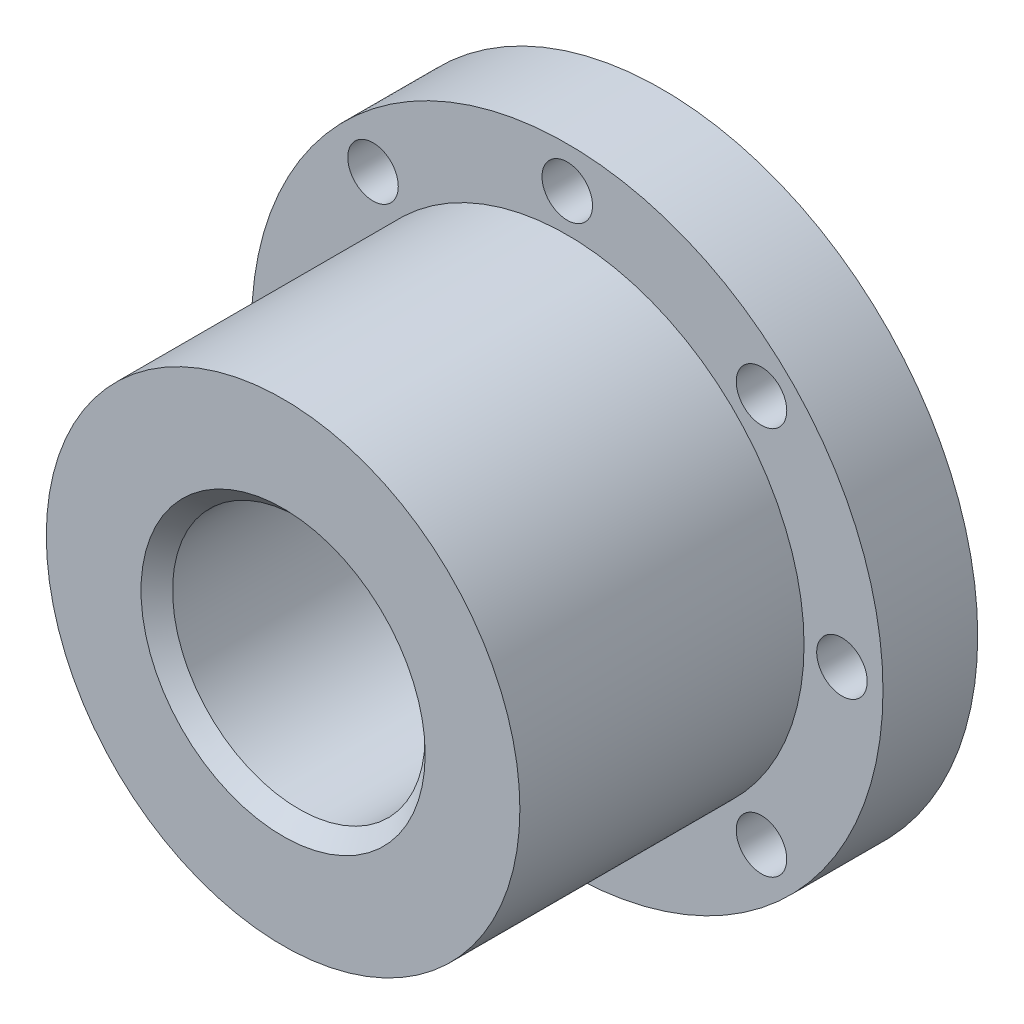
ISO-10303-21;
HEADER;
FILE_DESCRIPTION(('STEP AP214'),'2;1');
FILE_NAME('part.step','',(''),(''),'','','');
FILE_SCHEMA(('AUTOMOTIVE_DESIGN { 1 0 10303 214 1 1 1 1 }'));
ENDSEC;
DATA;
#1=APPLICATION_CONTEXT('core data for automotive mechanical design processes');
#2=APPLICATION_PROTOCOL_DEFINITION('international standard','automotive_design',2000,#1);
#3=PRODUCT_CONTEXT('',#1,'mechanical');
#4=PRODUCT('Part','Part','',(#3));
#5=PRODUCT_RELATED_PRODUCT_CATEGORY('part','',(#4));
#6=PRODUCT_DEFINITION_FORMATION('','',#4);
#7=PRODUCT_DEFINITION_CONTEXT('part definition',#1,'design');
#8=PRODUCT_DEFINITION('design','',#6,#7);
#9=PRODUCT_DEFINITION_SHAPE('','',#8);
#10=(LENGTH_UNIT() NAMED_UNIT(*) SI_UNIT(.MILLI.,.METRE.));
#11=(NAMED_UNIT(*) PLANE_ANGLE_UNIT() SI_UNIT($,.RADIAN.));
#12=(NAMED_UNIT(*) SI_UNIT($,.STERADIAN.) SOLID_ANGLE_UNIT());
#13=UNCERTAINTY_MEASURE_WITH_UNIT(LENGTH_MEASURE(1.E-05),#10,'distance_accuracy_value','');
#14=(GEOMETRIC_REPRESENTATION_CONTEXT(3) GLOBAL_UNCERTAINTY_ASSIGNED_CONTEXT((#13)) GLOBAL_UNIT_ASSIGNED_CONTEXT((#10,
#11,#12)) REPRESENTATION_CONTEXT('',''));
#15=CARTESIAN_POINT('',(0.,0.,0.));
#16=DIRECTION('',(0.,0.,1.));
#17=DIRECTION('',(1.,0.,0.));
#18=AXIS2_PLACEMENT_3D('',#15,#16,#17);
#19=CARTESIAN_POINT('',(0.,0.,30.));
#20=DIRECTION('',(0.,0.,-1.));
#21=DIRECTION('',(-1.,0.,0.));
#22=AXIS2_PLACEMENT_3D('',#19,#20,#21);
#23=CYLINDRICAL_SURFACE('',#22,100.);
#24=CARTESIAN_POINT('',(0.,0.,30.));
#25=DIRECTION('',(0.,0.,1.));
#26=DIRECTION('',(1.,0.,0.));
#27=AXIS2_PLACEMENT_3D('',#24,#25,#26);
#28=CIRCLE('',#27,100.);
#29=CARTESIAN_POINT('',(100.,0.,30.));
#30=VERTEX_POINT('',#29);
#31=EDGE_CURVE('E59',#30,#30,#28,.T.);
#32=ORIENTED_EDGE('',*,*,#31,.F.);
#33=EDGE_LOOP('',(#32));
#34=FACE_BOUND('',#33,.T.);
#35=CARTESIAN_POINT('',(0.,0.,0.));
#36=DIRECTION('',(0.,0.,1.));
#37=DIRECTION('',(1.,0.,0.));
#38=AXIS2_PLACEMENT_3D('',#35,#36,#37);
#39=CIRCLE('',#38,100.);
#40=CARTESIAN_POINT('',(100.,0.,0.));
#41=VERTEX_POINT('',#40);
#42=EDGE_CURVE('E66',#41,#41,#39,.T.);
#43=ORIENTED_EDGE('',*,*,#42,.T.);
#44=EDGE_LOOP('',(#43));
#45=FACE_BOUND('',#44,.T.);
#46=ADVANCED_FACE('F43',(#34,#45),#23,.T.);
#47=CARTESIAN_POINT('',(0.,0.,30.));
#48=DIRECTION('',(0.,0.,1.));
#49=DIRECTION('',(1.,0.,0.));
#50=AXIS2_PLACEMENT_3D('',#47,#48,#49);
#51=PLANE('',#50);
#52=CARTESIAN_POINT('',(87.,0.,30.));
#53=DIRECTION('',(0.,0.,1.));
#54=DIRECTION('',(1.,0.,0.));
#55=AXIS2_PLACEMENT_3D('',#52,#53,#54);
#56=CIRCLE('',#55,7.99999999999998);
#57=CARTESIAN_POINT('',(95.,0.,30.));
#58=VERTEX_POINT('',#57);
#59=EDGE_CURVE('E84',#58,#58,#56,.F.);
#60=ORIENTED_EDGE('',*,*,#59,.T.);
#61=EDGE_LOOP('',(#60));
#62=FACE_BOUND('',#61,.T.);
#63=CARTESIAN_POINT('',(61.5182899632296,61.5182899632296,30.));
#64=DIRECTION('',(0.,0.,1.));
#65=DIRECTION('',(1.,0.,0.));
#66=AXIS2_PLACEMENT_3D('',#63,#64,#65);
#67=CIRCLE('',#66,8.00000000000001);
#68=CARTESIAN_POINT('',(69.5182899632296,61.5182899632296,30.));
#69=VERTEX_POINT('',#68);
#70=EDGE_CURVE('E88',#69,#69,#67,.F.);
#71=ORIENTED_EDGE('',*,*,#70,.T.);
#72=EDGE_LOOP('',(#71));
#73=FACE_BOUND('',#72,.T.);
#74=CARTESIAN_POINT('',(0.,87.,30.));
#75=DIRECTION('',(0.,0.,1.));
#76=DIRECTION('',(1.,0.,0.));
#77=AXIS2_PLACEMENT_3D('',#74,#75,#76);
#78=CIRCLE('',#77,8.00000000000001);
#79=CARTESIAN_POINT('',(8.00000000000001,87.,30.));
#80=VERTEX_POINT('',#79);
#81=EDGE_CURVE('E92',#80,#80,#78,.F.);
#82=ORIENTED_EDGE('',*,*,#81,.T.);
#83=EDGE_LOOP('',(#82));
#84=FACE_BOUND('',#83,.T.);
#85=CARTESIAN_POINT('',(-61.5182899632296,61.5182899632296,30.));
#86=DIRECTION('',(0.,0.,1.));
#87=DIRECTION('',(1.,0.,0.));
#88=AXIS2_PLACEMENT_3D('',#85,#86,#87);
#89=CIRCLE('',#88,8.);
#90=CARTESIAN_POINT('',(-53.5182899632296,61.5182899632296,30.));
#91=VERTEX_POINT('',#90);
#92=EDGE_CURVE('E96',#91,#91,#89,.F.);
#93=ORIENTED_EDGE('',*,*,#92,.T.);
#94=EDGE_LOOP('',(#93));
#95=FACE_BOUND('',#94,.T.);
#96=CARTESIAN_POINT('',(-87.,0.,30.));
#97=DIRECTION('',(0.,0.,1.));
#98=DIRECTION('',(1.,0.,0.));
#99=AXIS2_PLACEMENT_3D('',#96,#97,#98);
#100=CIRCLE('',#99,8.);
#101=CARTESIAN_POINT('',(-79.,0.,30.));
#102=VERTEX_POINT('',#101);
#103=EDGE_CURVE('E100',#102,#102,#100,.F.);
#104=ORIENTED_EDGE('',*,*,#103,.T.);
#105=EDGE_LOOP('',(#104));
#106=FACE_BOUND('',#105,.T.);
#107=CARTESIAN_POINT('',(-61.5182899632296,-61.5182899632296,30.));
#108=DIRECTION('',(0.,0.,1.));
#109=DIRECTION('',(1.,0.,0.));
#110=AXIS2_PLACEMENT_3D('',#107,#108,#109);
#111=CIRCLE('',#110,7.99999999999998);
#112=CARTESIAN_POINT('',(-53.5182899632297,-61.5182899632296,30.));
#113=VERTEX_POINT('',#112);
#114=EDGE_CURVE('E104',#113,#113,#111,.F.);
#115=ORIENTED_EDGE('',*,*,#114,.T.);
#116=EDGE_LOOP('',(#115));
#117=FACE_BOUND('',#116,.T.);
#118=CARTESIAN_POINT('',(0.,-87.,30.));
#119=DIRECTION('',(0.,0.,1.));
#120=DIRECTION('',(1.,0.,0.));
#121=AXIS2_PLACEMENT_3D('',#118,#119,#120);
#122=CIRCLE('',#121,7.99999999999998);
#123=CARTESIAN_POINT('',(7.99999999999998,-87.,30.));
#124=VERTEX_POINT('',#123);
#125=EDGE_CURVE('E108',#124,#124,#122,.F.);
#126=ORIENTED_EDGE('',*,*,#125,.T.);
#127=EDGE_LOOP('',(#126));
#128=FACE_BOUND('',#127,.T.);
#129=CARTESIAN_POINT('',(61.5182899632296,-61.5182899632296,30.));
#130=DIRECTION('',(0.,0.,1.));
#131=DIRECTION('',(1.,0.,0.));
#132=AXIS2_PLACEMENT_3D('',#129,#130,#131);
#133=CIRCLE('',#132,7.99999999999998);
#134=CARTESIAN_POINT('',(69.5182899632296,-61.5182899632296,30.));
#135=VERTEX_POINT('',#134);
#136=EDGE_CURVE('E112',#135,#135,#133,.F.);
#137=ORIENTED_EDGE('',*,*,#136,.T.);
#138=EDGE_LOOP('',(#137));
#139=FACE_BOUND('',#138,.T.);
#140=CARTESIAN_POINT('',(0.,0.,30.));
#141=DIRECTION('',(0.,0.,1.));
#142=DIRECTION('',(1.,0.,0.));
#143=AXIS2_PLACEMENT_3D('',#140,#141,#142);
#144=CIRCLE('',#143,75.);
#145=CARTESIAN_POINT('',(75.,0.,30.));
#146=VERTEX_POINT('',#145);
#147=EDGE_CURVE('E71',#146,#146,#144,.F.);
#148=ORIENTED_EDGE('',*,*,#147,.T.);
#149=EDGE_LOOP('',(#148));
#150=FACE_BOUND('',#149,.T.);
#151=ORIENTED_EDGE('',*,*,#31,.T.);
#152=EDGE_LOOP('',(#151));
#153=FACE_BOUND('',#152,.T.);
#154=ADVANCED_FACE('F169',(#62,#73,#84,#95,#106,#117,#128,#139,#150,#153),#51,.T.);
#155=CARTESIAN_POINT('',(0.,0.,0.));
#156=DIRECTION('',(0.,0.,1.));
#157=DIRECTION('',(1.,0.,0.));
#158=AXIS2_PLACEMENT_3D('',#155,#156,#157);
#159=PLANE('',#158);
#160=CARTESIAN_POINT('',(87.,0.,0.));
#161=DIRECTION('',(0.,0.,1.));
#162=DIRECTION('',(1.,0.,0.));
#163=AXIS2_PLACEMENT_3D('',#160,#161,#162);
#164=CIRCLE('',#163,7.99999999999998);
#165=CARTESIAN_POINT('',(95.,0.,0.));
#166=VERTEX_POINT('',#165);
#167=EDGE_CURVE('E116',#166,#166,#164,.T.);
#168=ORIENTED_EDGE('',*,*,#167,.T.);
#169=EDGE_LOOP('',(#168));
#170=FACE_BOUND('',#169,.T.);
#171=CARTESIAN_POINT('',(61.5182899632296,61.5182899632296,0.));
#172=DIRECTION('',(0.,0.,1.));
#173=DIRECTION('',(1.,0.,0.));
#174=AXIS2_PLACEMENT_3D('',#171,#172,#173);
#175=CIRCLE('',#174,8.00000000000001);
#176=CARTESIAN_POINT('',(69.5182899632296,61.5182899632296,0.));
#177=VERTEX_POINT('',#176);
#178=EDGE_CURVE('E141',#177,#177,#175,.T.);
#179=ORIENTED_EDGE('',*,*,#178,.T.);
#180=EDGE_LOOP('',(#179));
#181=FACE_BOUND('',#180,.T.);
#182=CARTESIAN_POINT('',(0.,87.,0.));
#183=DIRECTION('',(0.,0.,1.));
#184=DIRECTION('',(1.,0.,0.));
#185=AXIS2_PLACEMENT_3D('',#182,#183,#184);
#186=CIRCLE('',#185,8.00000000000001);
#187=CARTESIAN_POINT('',(8.00000000000001,87.,0.));
#188=VERTEX_POINT('',#187);
#189=EDGE_CURVE('E137',#188,#188,#186,.T.);
#190=ORIENTED_EDGE('',*,*,#189,.T.);
#191=EDGE_LOOP('',(#190));
#192=FACE_BOUND('',#191,.T.);
#193=CARTESIAN_POINT('',(-61.5182899632296,61.5182899632296,0.));
#194=DIRECTION('',(0.,0.,1.));
#195=DIRECTION('',(1.,0.,0.));
#196=AXIS2_PLACEMENT_3D('',#193,#194,#195);
#197=CIRCLE('',#196,8.);
#198=CARTESIAN_POINT('',(-53.5182899632296,61.5182899632296,0.));
#199=VERTEX_POINT('',#198);
#200=EDGE_CURVE('E133',#199,#199,#197,.T.);
#201=ORIENTED_EDGE('',*,*,#200,.T.);
#202=EDGE_LOOP('',(#201));
#203=FACE_BOUND('',#202,.T.);
#204=CARTESIAN_POINT('',(-87.,0.,0.));
#205=DIRECTION('',(0.,0.,1.));
#206=DIRECTION('',(1.,0.,0.));
#207=AXIS2_PLACEMENT_3D('',#204,#205,#206);
#208=CIRCLE('',#207,8.);
#209=CARTESIAN_POINT('',(-79.,0.,0.));
#210=VERTEX_POINT('',#209);
#211=EDGE_CURVE('E129',#210,#210,#208,.T.);
#212=ORIENTED_EDGE('',*,*,#211,.T.);
#213=EDGE_LOOP('',(#212));
#214=FACE_BOUND('',#213,.T.);
#215=CARTESIAN_POINT('',(-61.5182899632296,-61.5182899632296,0.));
#216=DIRECTION('',(0.,0.,1.));
#217=DIRECTION('',(1.,0.,0.));
#218=AXIS2_PLACEMENT_3D('',#215,#216,#217);
#219=CIRCLE('',#218,7.99999999999998);
#220=CARTESIAN_POINT('',(-53.5182899632297,-61.5182899632296,0.));
#221=VERTEX_POINT('',#220);
#222=EDGE_CURVE('E125',#221,#221,#219,.T.);
#223=ORIENTED_EDGE('',*,*,#222,.T.);
#224=EDGE_LOOP('',(#223));
#225=FACE_BOUND('',#224,.T.);
#226=CARTESIAN_POINT('',(0.,-87.,0.));
#227=DIRECTION('',(0.,0.,1.));
#228=DIRECTION('',(1.,0.,0.));
#229=AXIS2_PLACEMENT_3D('',#226,#227,#228);
#230=CIRCLE('',#229,7.99999999999998);
#231=CARTESIAN_POINT('',(7.99999999999998,-87.,0.));
#232=VERTEX_POINT('',#231);
#233=EDGE_CURVE('E121',#232,#232,#230,.T.);
#234=ORIENTED_EDGE('',*,*,#233,.T.);
#235=EDGE_LOOP('',(#234));
#236=FACE_BOUND('',#235,.T.);
#237=CARTESIAN_POINT('',(61.5182899632296,-61.5182899632296,0.));
#238=DIRECTION('',(0.,0.,1.));
#239=DIRECTION('',(1.,0.,0.));
#240=AXIS2_PLACEMENT_3D('',#237,#238,#239);
#241=CIRCLE('',#240,7.99999999999998);
#242=CARTESIAN_POINT('',(69.5182899632296,-61.5182899632296,0.));
#243=VERTEX_POINT('',#242);
#244=EDGE_CURVE('E117',#243,#243,#241,.T.);
#245=ORIENTED_EDGE('',*,*,#244,.T.);
#246=EDGE_LOOP('',(#245));
#247=FACE_BOUND('',#246,.T.);
#248=CARTESIAN_POINT('',(0.,0.,0.));
#249=DIRECTION('',(0.,0.,1.));
#250=DIRECTION('',(1.,0.,0.));
#251=AXIS2_PLACEMENT_3D('',#248,#249,#250);
#252=CIRCLE('',#251,40.);
#253=CARTESIAN_POINT('',(40.,0.,0.));
#254=VERTEX_POINT('',#253);
#255=EDGE_CURVE('E80',#254,#254,#252,.T.);
#256=ORIENTED_EDGE('',*,*,#255,.T.);
#257=EDGE_LOOP('',(#256));
#258=FACE_BOUND('',#257,.T.);
#259=ORIENTED_EDGE('',*,*,#42,.F.);
#260=EDGE_LOOP('',(#259));
#261=FACE_BOUND('',#260,.T.);
#262=ADVANCED_FACE('F151',(#170,#181,#192,#203,#214,#225,#236,#247,#258,#261),#159,.F.);
#263=CARTESIAN_POINT('',(0.,0.,120.));
#264=DIRECTION('',(0.,0.,-1.));
#265=DIRECTION('',(-1.,0.,0.));
#266=AXIS2_PLACEMENT_3D('',#263,#264,#265);
#267=CYLINDRICAL_SURFACE('',#266,75.);
#268=ORIENTED_EDGE('',*,*,#147,.F.);
#269=EDGE_LOOP('',(#268));
#270=FACE_BOUND('',#269,.T.);
#271=CARTESIAN_POINT('',(0.,0.,120.));
#272=DIRECTION('',(0.,0.,1.));
#273=DIRECTION('',(1.,0.,0.));
#274=AXIS2_PLACEMENT_3D('',#271,#272,#273);
#275=CIRCLE('',#274,75.);
#276=CARTESIAN_POINT('',(75.,0.,120.));
#277=VERTEX_POINT('',#276);
#278=EDGE_CURVE('E76',#277,#277,#275,.T.);
#279=ORIENTED_EDGE('',*,*,#278,.F.);
#280=EDGE_LOOP('',(#279));
#281=FACE_BOUND('',#280,.T.);
#282=ADVANCED_FACE('F180',(#270,#281),#267,.T.);
#283=CARTESIAN_POINT('',(0.,0.,120.));
#284=DIRECTION('',(0.,0.,1.));
#285=DIRECTION('',(1.,0.,0.));
#286=AXIS2_PLACEMENT_3D('',#283,#284,#285);
#287=PLANE('',#286);
#288=CARTESIAN_POINT('',(0.,0.,120.));
#289=DIRECTION('',(0.,0.,1.));
#290=DIRECTION('',(1.,0.,0.));
#291=AXIS2_PLACEMENT_3D('',#288,#289,#290);
#292=CIRCLE('',#291,45.);
#293=CARTESIAN_POINT('',(45.,0.,120.));
#294=VERTEX_POINT('',#293);
#295=EDGE_CURVE('E10',#294,#294,#292,.F.);
#296=ORIENTED_EDGE('',*,*,#295,.T.);
#297=EDGE_LOOP('',(#296));
#298=FACE_BOUND('',#297,.T.);
#299=ORIENTED_EDGE('',*,*,#278,.T.);
#300=EDGE_LOOP('',(#299));
#301=FACE_BOUND('',#300,.T.);
#302=ADVANCED_FACE('F184',(#298,#301),#287,.T.);
#303=CARTESIAN_POINT('',(0.,0.,120.));
#304=DIRECTION('',(0.,0.,-1.));
#305=DIRECTION('',(-1.,0.,0.));
#306=AXIS2_PLACEMENT_3D('',#303,#304,#305);
#307=CYLINDRICAL_SURFACE('',#306,40.);
#308=CARTESIAN_POINT('',(0.,0.,115.));
#309=DIRECTION('',(0.,0.,1.));
#310=DIRECTION('',(1.,0.,0.));
#311=AXIS2_PLACEMENT_3D('',#308,#309,#310);
#312=CIRCLE('',#311,40.);
#313=CARTESIAN_POINT('',(40.,0.,115.));
#314=VERTEX_POINT('',#313);
#315=EDGE_CURVE('E52',#314,#314,#312,.T.);
#316=ORIENTED_EDGE('',*,*,#315,.T.);
#317=EDGE_LOOP('',(#316));
#318=FACE_BOUND('',#317,.T.);
#319=ORIENTED_EDGE('',*,*,#255,.F.);
#320=EDGE_LOOP('',(#319));
#321=FACE_BOUND('',#320,.T.);
#322=ADVANCED_FACE('F188',(#318,#321),#307,.F.);
#323=CARTESIAN_POINT('',(61.5182899632296,-61.5182899632296,120.));
#324=DIRECTION('',(0.,0.,-1.));
#325=DIRECTION('',(-1.,0.,0.));
#326=AXIS2_PLACEMENT_3D('',#323,#324,#325);
#327=CYLINDRICAL_SURFACE('',#326,7.99999999999998);
#328=ORIENTED_EDGE('',*,*,#136,.F.);
#329=EDGE_LOOP('',(#328));
#330=FACE_BOUND('',#329,.T.);
#331=ORIENTED_EDGE('',*,*,#244,.F.);
#332=EDGE_LOOP('',(#331));
#333=FACE_BOUND('',#332,.T.);
#334=ADVANCED_FACE('F191',(#330,#333),#327,.F.);
#335=CARTESIAN_POINT('',(0.,-87.,120.));
#336=DIRECTION('',(0.,0.,-1.));
#337=DIRECTION('',(-1.,0.,0.));
#338=AXIS2_PLACEMENT_3D('',#335,#336,#337);
#339=CYLINDRICAL_SURFACE('',#338,7.99999999999998);
#340=ORIENTED_EDGE('',*,*,#125,.F.);
#341=EDGE_LOOP('',(#340));
#342=FACE_BOUND('',#341,.T.);
#343=ORIENTED_EDGE('',*,*,#233,.F.);
#344=EDGE_LOOP('',(#343));
#345=FACE_BOUND('',#344,.T.);
#346=ADVANCED_FACE('F194',(#342,#345),#339,.F.);
#347=CARTESIAN_POINT('',(-61.5182899632296,-61.5182899632296,120.));
#348=DIRECTION('',(0.,0.,-1.));
#349=DIRECTION('',(-1.,0.,0.));
#350=AXIS2_PLACEMENT_3D('',#347,#348,#349);
#351=CYLINDRICAL_SURFACE('',#350,7.99999999999998);
#352=ORIENTED_EDGE('',*,*,#114,.F.);
#353=EDGE_LOOP('',(#352));
#354=FACE_BOUND('',#353,.T.);
#355=ORIENTED_EDGE('',*,*,#222,.F.);
#356=EDGE_LOOP('',(#355));
#357=FACE_BOUND('',#356,.T.);
#358=ADVANCED_FACE('F198',(#354,#357),#351,.F.);
#359=CARTESIAN_POINT('',(-87.,0.,120.));
#360=DIRECTION('',(0.,0.,-1.));
#361=DIRECTION('',(-1.,0.,0.));
#362=AXIS2_PLACEMENT_3D('',#359,#360,#361);
#363=CYLINDRICAL_SURFACE('',#362,8.);
#364=ORIENTED_EDGE('',*,*,#103,.F.);
#365=EDGE_LOOP('',(#364));
#366=FACE_BOUND('',#365,.T.);
#367=ORIENTED_EDGE('',*,*,#211,.F.);
#368=EDGE_LOOP('',(#367));
#369=FACE_BOUND('',#368,.T.);
#370=ADVANCED_FACE('F202',(#366,#369),#363,.F.);
#371=CARTESIAN_POINT('',(-61.5182899632296,61.5182899632296,120.));
#372=DIRECTION('',(0.,0.,-1.));
#373=DIRECTION('',(-1.,0.,0.));
#374=AXIS2_PLACEMENT_3D('',#371,#372,#373);
#375=CYLINDRICAL_SURFACE('',#374,8.);
#376=ORIENTED_EDGE('',*,*,#92,.F.);
#377=EDGE_LOOP('',(#376));
#378=FACE_BOUND('',#377,.T.);
#379=ORIENTED_EDGE('',*,*,#200,.F.);
#380=EDGE_LOOP('',(#379));
#381=FACE_BOUND('',#380,.T.);
#382=ADVANCED_FACE('F206',(#378,#381),#375,.F.);
#383=CARTESIAN_POINT('',(0.,87.,120.));
#384=DIRECTION('',(0.,0.,-1.));
#385=DIRECTION('',(-1.,0.,0.));
#386=AXIS2_PLACEMENT_3D('',#383,#384,#385);
#387=CYLINDRICAL_SURFACE('',#386,8.00000000000001);
#388=ORIENTED_EDGE('',*,*,#81,.F.);
#389=EDGE_LOOP('',(#388));
#390=FACE_BOUND('',#389,.T.);
#391=ORIENTED_EDGE('',*,*,#189,.F.);
#392=EDGE_LOOP('',(#391));
#393=FACE_BOUND('',#392,.T.);
#394=ADVANCED_FACE('F164',(#390,#393),#387,.F.);
#395=CARTESIAN_POINT('',(61.5182899632296,61.5182899632296,120.));
#396=DIRECTION('',(0.,0.,-1.));
#397=DIRECTION('',(-1.,0.,0.));
#398=AXIS2_PLACEMENT_3D('',#395,#396,#397);
#399=CYLINDRICAL_SURFACE('',#398,8.00000000000001);
#400=ORIENTED_EDGE('',*,*,#70,.F.);
#401=EDGE_LOOP('',(#400));
#402=FACE_BOUND('',#401,.T.);
#403=ORIENTED_EDGE('',*,*,#178,.F.);
#404=EDGE_LOOP('',(#403));
#405=FACE_BOUND('',#404,.T.);
#406=ADVANCED_FACE('F156',(#402,#405),#399,.F.);
#407=CARTESIAN_POINT('',(87.,0.,120.));
#408=DIRECTION('',(0.,0.,-1.));
#409=DIRECTION('',(-1.,0.,0.));
#410=AXIS2_PLACEMENT_3D('',#407,#408,#409);
#411=CYLINDRICAL_SURFACE('',#410,7.99999999999998);
#412=ORIENTED_EDGE('',*,*,#59,.F.);
#413=EDGE_LOOP('',(#412));
#414=FACE_BOUND('',#413,.T.);
#415=ORIENTED_EDGE('',*,*,#167,.F.);
#416=EDGE_LOOP('',(#415));
#417=FACE_BOUND('',#416,.T.);
#418=ADVANCED_FACE('F154',(#414,#417),#411,.F.);
#419=CARTESIAN_POINT('',(0.,0.,115.));
#420=DIRECTION('',(0.,0.,1.));
#421=DIRECTION('',(1.,0.,0.));
#422=AXIS2_PLACEMENT_3D('',#419,#420,#421);
#423=CONICAL_SURFACE('',#422,40.,0.78539816339745);
#424=ORIENTED_EDGE('',*,*,#295,.F.);
#425=EDGE_LOOP('',(#424));
#426=FACE_BOUND('',#425,.T.);
#427=ORIENTED_EDGE('',*,*,#315,.F.);
#428=EDGE_LOOP('',(#427));
#429=FACE_BOUND('',#428,.T.);
#430=ADVANCED_FACE('F46',(#426,#429),#423,.F.);
#431=CLOSED_SHELL('',(#46,#154,#262,#282,#302,#322,#334,#346,#358,#370,#382,#394,#406,#418,#430));
#432=MANIFOLD_SOLID_BREP('B2',#431);
#433=ADVANCED_BREP_SHAPE_REPRESENTATION('',(#18,#432),#14);
#434=SHAPE_DEFINITION_REPRESENTATION(#9,#433);
ENDSEC;
END-ISO-10303-21;
